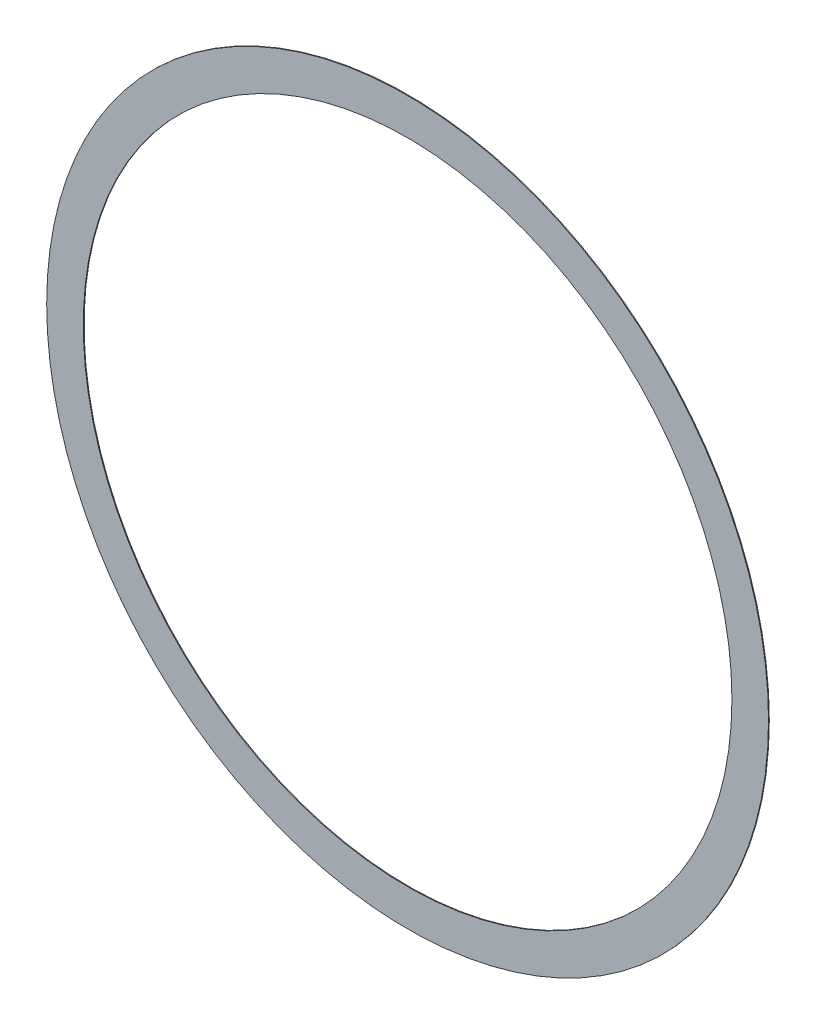
ISO-10303-21;
HEADER;
FILE_DESCRIPTION(('STEP AP214'),'2;1');
FILE_NAME('part.step','',(''),(''),'','','');
FILE_SCHEMA(('AUTOMOTIVE_DESIGN { 1 0 10303 214 1 1 1 1 }'));
ENDSEC;
DATA;
#1=APPLICATION_CONTEXT('core data for automotive mechanical design processes');
#2=APPLICATION_PROTOCOL_DEFINITION('international standard','automotive_design',2000,#1);
#3=PRODUCT_CONTEXT('',#1,'mechanical');
#4=PRODUCT('Part','Part','',(#3));
#5=PRODUCT_RELATED_PRODUCT_CATEGORY('part','',(#4));
#6=PRODUCT_DEFINITION_FORMATION('','',#4);
#7=PRODUCT_DEFINITION_CONTEXT('part definition',#1,'design');
#8=PRODUCT_DEFINITION('design','',#6,#7);
#9=PRODUCT_DEFINITION_SHAPE('','',#8);
#10=(LENGTH_UNIT() NAMED_UNIT(*) SI_UNIT(.MILLI.,.METRE.));
#11=(NAMED_UNIT(*) PLANE_ANGLE_UNIT() SI_UNIT($,.RADIAN.));
#12=(NAMED_UNIT(*) SI_UNIT($,.STERADIAN.) SOLID_ANGLE_UNIT());
#13=UNCERTAINTY_MEASURE_WITH_UNIT(LENGTH_MEASURE(1.E-05),#10,'distance_accuracy_value','');
#14=(GEOMETRIC_REPRESENTATION_CONTEXT(3) GLOBAL_UNCERTAINTY_ASSIGNED_CONTEXT((#13)) GLOBAL_UNIT_ASSIGNED_CONTEXT((#10,
#11,#12)) REPRESENTATION_CONTEXT('',''));
#15=CARTESIAN_POINT('',(0.,0.,0.));
#16=DIRECTION('',(0.,0.,1.));
#17=DIRECTION('',(1.,0.,0.));
#18=AXIS2_PLACEMENT_3D('',#15,#16,#17);
#19=CARTESIAN_POINT('',(0.,0.,0.15));
#20=DIRECTION('',(0.,0.,1.));
#21=DIRECTION('',(1.,0.,0.));
#22=AXIS2_PLACEMENT_3D('',#19,#20,#21);
#23=PLANE('',#22);
#24=CARTESIAN_POINT('',(0.,0.,0.15));
#25=DIRECTION('',(0.,0.,1.));
#26=DIRECTION('',(1.,0.,0.));
#27=AXIS2_PLACEMENT_3D('',#24,#25,#26);
#28=CIRCLE('',#27,69.);
#29=CARTESIAN_POINT('',(69.,0.,0.15));
#30=VERTEX_POINT('',#29);
#31=EDGE_CURVE('E10',#30,#30,#28,.T.);
#32=ORIENTED_EDGE('',*,*,#31,.T.);
#33=EDGE_LOOP('',(#32));
#34=FACE_BOUND('',#33,.T.);
#35=CARTESIAN_POINT('',(0.,0.,0.15));
#36=DIRECTION('',(0.,0.,1.));
#37=DIRECTION('',(1.,0.,0.));
#38=AXIS2_PLACEMENT_3D('',#35,#36,#37);
#39=CIRCLE('',#38,62.);
#40=CARTESIAN_POINT('',(62.,0.,0.15));
#41=VERTEX_POINT('',#40);
#42=EDGE_CURVE('E48',#41,#41,#39,.T.);
#43=ORIENTED_EDGE('',*,*,#42,.F.);
#44=EDGE_LOOP('',(#43));
#45=FACE_BOUND('',#44,.T.);
#46=ADVANCED_FACE('F37',(#34,#45),#23,.T.);
#47=CARTESIAN_POINT('',(0.,0.,0.));
#48=DIRECTION('',(0.,0.,1.));
#49=DIRECTION('',(1.,0.,0.));
#50=AXIS2_PLACEMENT_3D('',#47,#48,#49);
#51=PLANE('',#50);
#52=CARTESIAN_POINT('',(0.,0.,0.));
#53=DIRECTION('',(0.,0.,1.));
#54=DIRECTION('',(1.,0.,0.));
#55=AXIS2_PLACEMENT_3D('',#52,#53,#54);
#56=CIRCLE('',#55,69.);
#57=CARTESIAN_POINT('',(69.,0.,0.));
#58=VERTEX_POINT('',#57);
#59=EDGE_CURVE('E41',#58,#58,#56,.T.);
#60=ORIENTED_EDGE('',*,*,#59,.F.);
#61=EDGE_LOOP('',(#60));
#62=FACE_BOUND('',#61,.T.);
#63=CARTESIAN_POINT('',(0.,0.,0.));
#64=DIRECTION('',(0.,0.,1.));
#65=DIRECTION('',(1.,0.,0.));
#66=AXIS2_PLACEMENT_3D('',#63,#64,#65);
#67=CIRCLE('',#66,62.);
#68=CARTESIAN_POINT('',(62.,0.,0.));
#69=VERTEX_POINT('',#68);
#70=EDGE_CURVE('E50',#69,#69,#67,.T.);
#71=ORIENTED_EDGE('',*,*,#70,.T.);
#72=EDGE_LOOP('',(#71));
#73=FACE_BOUND('',#72,.T.);
#74=ADVANCED_FACE('F60',(#62,#73),#51,.F.);
#75=CARTESIAN_POINT('',(0.,0.,0.15));
#76=DIRECTION('',(0.,0.,-1.));
#77=DIRECTION('',(-1.,0.,0.));
#78=AXIS2_PLACEMENT_3D('',#75,#76,#77);
#79=CYLINDRICAL_SURFACE('',#78,69.);
#80=ORIENTED_EDGE('',*,*,#31,.F.);
#81=EDGE_LOOP('',(#80));
#82=FACE_BOUND('',#81,.T.);
#83=ORIENTED_EDGE('',*,*,#59,.T.);
#84=EDGE_LOOP('',(#83));
#85=FACE_BOUND('',#84,.T.);
#86=ADVANCED_FACE('F39',(#82,#85),#79,.T.);
#87=CARTESIAN_POINT('',(0.,0.,0.15));
#88=DIRECTION('',(0.,0.,-1.));
#89=DIRECTION('',(-1.,0.,0.));
#90=AXIS2_PLACEMENT_3D('',#87,#88,#89);
#91=CYLINDRICAL_SURFACE('',#90,62.);
#92=ORIENTED_EDGE('',*,*,#42,.T.);
#93=EDGE_LOOP('',(#92));
#94=FACE_BOUND('',#93,.T.);
#95=ORIENTED_EDGE('',*,*,#70,.F.);
#96=EDGE_LOOP('',(#95));
#97=FACE_BOUND('',#96,.T.);
#98=ADVANCED_FACE('F56',(#94,#97),#91,.F.);
#99=CLOSED_SHELL('',(#46,#74,#86,#98));
#100=MANIFOLD_SOLID_BREP('B2',#99);
#101=ADVANCED_BREP_SHAPE_REPRESENTATION('',(#18,#100),#14);
#102=SHAPE_DEFINITION_REPRESENTATION(#9,#101);
ENDSEC;
END-ISO-10303-21;
